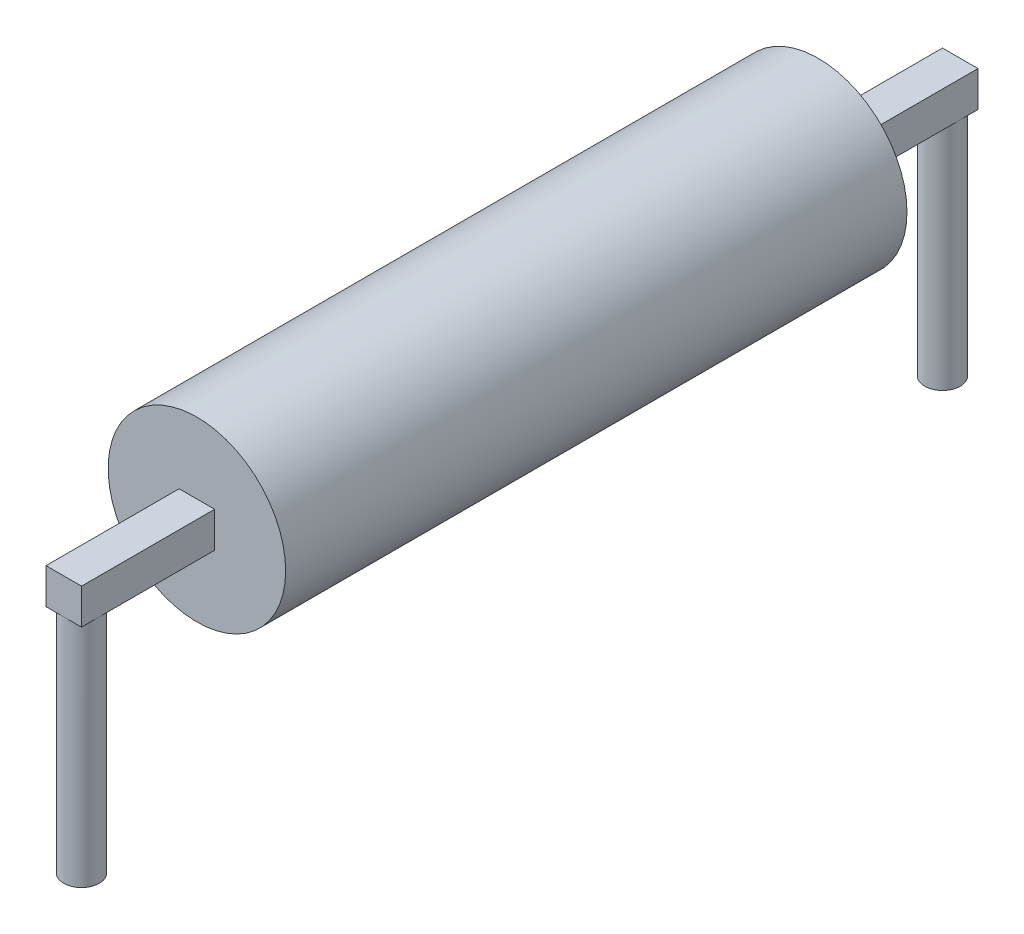
ISO-10303-21;
HEADER;
FILE_DESCRIPTION(('STEP AP214'),'2;1');
FILE_NAME('part.step','',(''),(''),'','','');
FILE_SCHEMA(('AUTOMOTIVE_DESIGN { 1 0 10303 214 1 1 1 1 }'));
ENDSEC;
DATA;
#1=APPLICATION_CONTEXT('core data for automotive mechanical design processes');
#2=APPLICATION_PROTOCOL_DEFINITION('international standard','automotive_design',2000,#1);
#3=PRODUCT_CONTEXT('',#1,'mechanical');
#4=PRODUCT('Part','Part','',(#3));
#5=PRODUCT_RELATED_PRODUCT_CATEGORY('part','',(#4));
#6=PRODUCT_DEFINITION_FORMATION('','',#4);
#7=PRODUCT_DEFINITION_CONTEXT('part definition',#1,'design');
#8=PRODUCT_DEFINITION('design','',#6,#7);
#9=PRODUCT_DEFINITION_SHAPE('','',#8);
#10=(LENGTH_UNIT() NAMED_UNIT(*) SI_UNIT(.MILLI.,.METRE.));
#11=(NAMED_UNIT(*) PLANE_ANGLE_UNIT() SI_UNIT($,.RADIAN.));
#12=(NAMED_UNIT(*) SI_UNIT($,.STERADIAN.) SOLID_ANGLE_UNIT());
#13=UNCERTAINTY_MEASURE_WITH_UNIT(LENGTH_MEASURE(1.E-05),#10,'distance_accuracy_value','');
#14=(GEOMETRIC_REPRESENTATION_CONTEXT(3) GLOBAL_UNCERTAINTY_ASSIGNED_CONTEXT((#13)) GLOBAL_UNIT_ASSIGNED_CONTEXT((#10,
#11,#12)) REPRESENTATION_CONTEXT('',''));
#15=CARTESIAN_POINT('',(0.,0.,0.));
#16=DIRECTION('',(0.,0.,1.));
#17=DIRECTION('',(1.,0.,0.));
#18=AXIS2_PLACEMENT_3D('',#15,#16,#17);
#19=CARTESIAN_POINT('',(-0.5,-0.5,21.25));
#20=DIRECTION('',(0.,1.,0.));
#21=DIRECTION('',(-1.,0.,0.));
#22=AXIS2_PLACEMENT_3D('',#19,#20,#21);
#23=PLANE('',#22);
#24=CARTESIAN_POINT('',(0.,-0.5,-3.5));
#25=DIRECTION('',(0.,-1.,0.));
#26=DIRECTION('',(1.,0.,0.));
#27=AXIS2_PLACEMENT_3D('',#24,#25,#26);
#28=CIRCLE('',#27,0.5);
#29=CARTESIAN_POINT('',(-0.5,-0.5,-3.5));
#30=VERTEX_POINT('',#29);
#31=CARTESIAN_POINT('',(0.,-0.5,-4.));
#32=VERTEX_POINT('',#31);
#33=EDGE_CURVE('E129',#30,#32,#28,.T.);
#34=ORIENTED_EDGE('',*,*,#33,.F.);
#35=DIRECTION('',(0.,0.,-1.));
#36=VECTOR('',#35,1.);
#37=CARTESIAN_POINT('',(-0.5,-0.5,21.25));
#38=LINE('',#37,#36);
#39=CARTESIAN_POINT('',(-0.5,-0.5,-4.));
#40=VERTEX_POINT('',#39);
#41=EDGE_CURVE('E116',#30,#40,#38,.T.);
#42=ORIENTED_EDGE('',*,*,#41,.T.);
#43=DIRECTION('',(1.,0.,0.));
#44=VECTOR('',#43,1.);
#45=CARTESIAN_POINT('',(-0.5,-0.5,-4.));
#46=LINE('',#45,#44);
#47=EDGE_CURVE('E130',#40,#32,#46,.T.);
#48=ORIENTED_EDGE('',*,*,#47,.T.);
#49=EDGE_LOOP('',(#34,#42,#48));
#50=FACE_BOUND('',#49,.T.);
#51=ADVANCED_FACE('F28',(#50),#23,.F.);
#52=CARTESIAN_POINT('',(0.5,-0.5,-3.5));
#53=VERTEX_POINT('',#52);
#54=EDGE_CURVE('E43',#32,#53,#28,.T.);
#55=ORIENTED_EDGE('',*,*,#54,.F.);
#56=CARTESIAN_POINT('',(0.5,-0.5,-4.));
#57=VERTEX_POINT('',#56);
#58=EDGE_CURVE('E147',#32,#57,#46,.T.);
#59=ORIENTED_EDGE('',*,*,#58,.T.);
#60=DIRECTION('',(0.,0.,-1.));
#61=VECTOR('',#60,1.);
#62=CARTESIAN_POINT('',(0.5,-0.5,21.25));
#63=LINE('',#62,#61);
#64=EDGE_CURVE('E173',#53,#57,#63,.T.);
#65=ORIENTED_EDGE('',*,*,#64,.F.);
#66=EDGE_LOOP('',(#55,#59,#65));
#67=FACE_BOUND('',#66,.T.);
#68=ADVANCED_FACE('F229',(#67),#23,.F.);
#69=EDGE_CURVE('E51',#53,#30,#28,.T.);
#70=ORIENTED_EDGE('',*,*,#69,.F.);
#71=CARTESIAN_POINT('',(0.5,-0.5,0.));
#72=VERTEX_POINT('',#71);
#73=EDGE_CURVE('E176',#72,#53,#63,.T.);
#74=ORIENTED_EDGE('',*,*,#73,.F.);
#75=DIRECTION('',(-1.,0.,0.));
#76=VECTOR('',#75,1.);
#77=CARTESIAN_POINT('',(0.,-0.5,0.));
#78=LINE('',#77,#76);
#79=CARTESIAN_POINT('',(-0.5,-0.5,0.));
#80=VERTEX_POINT('',#79);
#81=EDGE_CURVE('E36',#72,#80,#78,.T.);
#82=ORIENTED_EDGE('',*,*,#81,.T.);
#83=EDGE_CURVE('E111',#80,#30,#38,.T.);
#84=ORIENTED_EDGE('',*,*,#83,.T.);
#85=EDGE_LOOP('',(#70,#74,#82,#84));
#86=FACE_BOUND('',#85,.T.);
#87=ADVANCED_FACE('F113',(#86),#23,.F.);
#88=CARTESIAN_POINT('',(0.,-0.5,20.75));
#89=DIRECTION('',(0.,-1.,0.));
#90=DIRECTION('',(1.,0.,0.));
#91=AXIS2_PLACEMENT_3D('',#88,#89,#90);
#92=CIRCLE('',#91,0.500000000000001);
#93=CARTESIAN_POINT('',(-0.5,-0.5,20.75));
#94=VERTEX_POINT('',#93);
#95=CARTESIAN_POINT('',(0.5,-0.5,20.75));
#96=VERTEX_POINT('',#95);
#97=EDGE_CURVE('E136',#94,#96,#92,.T.);
#98=ORIENTED_EDGE('',*,*,#97,.F.);
#99=CARTESIAN_POINT('',(-0.5,-0.5,17.5));
#100=VERTEX_POINT('',#99);
#101=EDGE_CURVE('E115',#94,#100,#38,.T.);
#102=ORIENTED_EDGE('',*,*,#101,.T.);
#103=DIRECTION('',(-1.,0.,0.));
#104=VECTOR('',#103,1.);
#105=CARTESIAN_POINT('',(0.,-0.5,17.5));
#106=LINE('',#105,#104);
#107=CARTESIAN_POINT('',(0.5,-0.5,17.5));
#108=VERTEX_POINT('',#107);
#109=EDGE_CURVE('E184',#108,#100,#106,.T.);
#110=ORIENTED_EDGE('',*,*,#109,.F.);
#111=EDGE_CURVE('E175',#96,#108,#63,.T.);
#112=ORIENTED_EDGE('',*,*,#111,.F.);
#113=EDGE_LOOP('',(#98,#102,#110,#112));
#114=FACE_BOUND('',#113,.T.);
#115=ADVANCED_FACE('F231',(#114),#23,.F.);
#116=CARTESIAN_POINT('',(0.,-0.5,21.25));
#117=VERTEX_POINT('',#116);
#118=EDGE_CURVE('E139',#96,#117,#92,.T.);
#119=ORIENTED_EDGE('',*,*,#118,.F.);
#120=CARTESIAN_POINT('',(0.5,-0.5,21.25));
#121=VERTEX_POINT('',#120);
#122=EDGE_CURVE('E127',#121,#96,#63,.T.);
#123=ORIENTED_EDGE('',*,*,#122,.F.);
#124=DIRECTION('',(1.,0.,0.));
#125=VECTOR('',#124,1.);
#126=CARTESIAN_POINT('',(-0.5,-0.5,21.25));
#127=LINE('',#126,#125);
#128=EDGE_CURVE('E158',#117,#121,#127,.T.);
#129=ORIENTED_EDGE('',*,*,#128,.F.);
#130=EDGE_LOOP('',(#119,#123,#129));
#131=FACE_BOUND('',#130,.T.);
#132=ADVANCED_FACE('F237',(#131),#23,.F.);
#133=EDGE_CURVE('E143',#117,#94,#92,.T.);
#134=ORIENTED_EDGE('',*,*,#133,.F.);
#135=CARTESIAN_POINT('',(-0.5,-0.5,21.25));
#136=VERTEX_POINT('',#135);
#137=EDGE_CURVE('E159',#136,#117,#127,.T.);
#138=ORIENTED_EDGE('',*,*,#137,.F.);
#139=EDGE_CURVE('E118',#136,#94,#38,.T.);
#140=ORIENTED_EDGE('',*,*,#139,.T.);
#141=EDGE_LOOP('',(#134,#138,#140));
#142=FACE_BOUND('',#141,.T.);
#143=ADVANCED_FACE('F224',(#142),#23,.F.);
#144=CARTESIAN_POINT('',(0.,0.,17.5));
#145=DIRECTION('',(0.,0.,1.));
#146=DIRECTION('',(1.,0.,0.));
#147=AXIS2_PLACEMENT_3D('',#144,#145,#146);
#148=PLANE('',#147);
#149=CARTESIAN_POINT('',(0.,0.,17.5));
#150=DIRECTION('',(0.,0.,1.));
#151=DIRECTION('',(1.,0.,0.));
#152=AXIS2_PLACEMENT_3D('',#149,#150,#151);
#153=CIRCLE('',#152,2.5);
#154=CARTESIAN_POINT('',(2.5,0.,17.5));
#155=VERTEX_POINT('',#154);
#156=EDGE_CURVE('E193',#155,#155,#153,.T.);
#157=ORIENTED_EDGE('',*,*,#156,.T.);
#158=EDGE_LOOP('',(#157));
#159=FACE_BOUND('',#158,.T.);
#160=ORIENTED_EDGE('',*,*,#109,.T.);
#161=DIRECTION('',(0.,1.,0.));
#162=VECTOR('',#161,1.);
#163=CARTESIAN_POINT('',(-0.5,0.,17.5));
#164=LINE('',#163,#162);
#165=CARTESIAN_POINT('',(-0.5,0.5,17.5));
#166=VERTEX_POINT('',#165);
#167=EDGE_CURVE('E187',#100,#166,#164,.T.);
#168=ORIENTED_EDGE('',*,*,#167,.T.);
#169=DIRECTION('',(1.,0.,0.));
#170=VECTOR('',#169,1.);
#171=CARTESIAN_POINT('',(0.,0.5,17.5));
#172=LINE('',#171,#170);
#173=CARTESIAN_POINT('',(0.5,0.5,17.5));
#174=VERTEX_POINT('',#173);
#175=EDGE_CURVE('E178',#166,#174,#172,.T.);
#176=ORIENTED_EDGE('',*,*,#175,.T.);
#177=DIRECTION('',(0.,-1.,0.));
#178=VECTOR('',#177,1.);
#179=CARTESIAN_POINT('',(0.5,0.,17.5));
#180=LINE('',#179,#178);
#181=EDGE_CURVE('E181',#174,#108,#180,.T.);
#182=ORIENTED_EDGE('',*,*,#181,.T.);
#183=EDGE_LOOP('',(#160,#168,#176,#182));
#184=FACE_BOUND('',#183,.T.);
#185=ADVANCED_FACE('F216',(#159,#184),#148,.T.);
#186=CARTESIAN_POINT('',(0.,0.,0.));
#187=DIRECTION('',(0.,0.,1.));
#188=DIRECTION('',(1.,0.,0.));
#189=AXIS2_PLACEMENT_3D('',#186,#187,#188);
#190=PLANE('',#189);
#191=CARTESIAN_POINT('',(0.,0.,0.));
#192=DIRECTION('',(0.,0.,1.));
#193=DIRECTION('',(1.,0.,0.));
#194=AXIS2_PLACEMENT_3D('',#191,#192,#193);
#195=CIRCLE('',#194,2.5);
#196=CARTESIAN_POINT('',(2.5,0.,0.));
#197=VERTEX_POINT('',#196);
#198=EDGE_CURVE('E190',#197,#197,#195,.T.);
#199=ORIENTED_EDGE('',*,*,#198,.F.);
#200=EDGE_LOOP('',(#199));
#201=FACE_BOUND('',#200,.T.);
#202=DIRECTION('',(0.,1.,0.));
#203=VECTOR('',#202,1.);
#204=CARTESIAN_POINT('',(-0.5,0.,0.));
#205=LINE('',#204,#203);
#206=CARTESIAN_POINT('',(-0.5,0.5,0.));
#207=VERTEX_POINT('',#206);
#208=EDGE_CURVE('E11',#80,#207,#205,.T.);
#209=ORIENTED_EDGE('',*,*,#208,.F.);
#210=ORIENTED_EDGE('',*,*,#81,.F.);
#211=DIRECTION('',(0.,-1.,0.));
#212=VECTOR('',#211,1.);
#213=CARTESIAN_POINT('',(0.5,0.,0.));
#214=LINE('',#213,#212);
#215=CARTESIAN_POINT('',(0.5,0.5,0.));
#216=VERTEX_POINT('',#215);
#217=EDGE_CURVE('E199',#216,#72,#214,.T.);
#218=ORIENTED_EDGE('',*,*,#217,.F.);
#219=DIRECTION('',(1.,0.,0.));
#220=VECTOR('',#219,1.);
#221=CARTESIAN_POINT('',(0.,0.5,0.));
#222=LINE('',#221,#220);
#223=EDGE_CURVE('E196',#207,#216,#222,.T.);
#224=ORIENTED_EDGE('',*,*,#223,.F.);
#225=EDGE_LOOP('',(#209,#210,#218,#224));
#226=FACE_BOUND('',#225,.T.);
#227=ADVANCED_FACE('F214',(#201,#226),#190,.F.);
#228=CARTESIAN_POINT('',(0.,0.,17.5));
#229=DIRECTION('',(0.,0.,-1.));
#230=DIRECTION('',(-1.,0.,0.));
#231=AXIS2_PLACEMENT_3D('',#228,#229,#230);
#232=CYLINDRICAL_SURFACE('',#231,2.5);
#233=ORIENTED_EDGE('',*,*,#156,.F.);
#234=EDGE_LOOP('',(#233));
#235=FACE_BOUND('',#234,.T.);
#236=ORIENTED_EDGE('',*,*,#198,.T.);
#237=EDGE_LOOP('',(#236));
#238=FACE_BOUND('',#237,.T.);
#239=ADVANCED_FACE('F30',(#235,#238),#232,.T.);
#240=CARTESIAN_POINT('',(-0.5,-0.5,-4.));
#241=DIRECTION('',(0.,0.,-1.));
#242=DIRECTION('',(-1.,0.,0.));
#243=AXIS2_PLACEMENT_3D('',#240,#241,#242);
#244=PLANE('',#243);
#245=DIRECTION('',(0.,-1.,0.));
#246=VECTOR('',#245,1.);
#247=CARTESIAN_POINT('',(-0.5,-0.5,-4.));
#248=LINE('',#247,#246);
#249=CARTESIAN_POINT('',(-0.5,0.5,-4.));
#250=VERTEX_POINT('',#249);
#251=EDGE_CURVE('E123',#250,#40,#248,.T.);
#252=ORIENTED_EDGE('',*,*,#251,.F.);
#253=DIRECTION('',(-1.,0.,0.));
#254=VECTOR('',#253,1.);
#255=CARTESIAN_POINT('',(-0.5,0.5,-4.));
#256=LINE('',#255,#254);
#257=CARTESIAN_POINT('',(0.5,0.5,-4.));
#258=VERTEX_POINT('',#257);
#259=EDGE_CURVE('E152',#258,#250,#256,.T.);
#260=ORIENTED_EDGE('',*,*,#259,.F.);
#261=DIRECTION('',(0.,1.,0.));
#262=VECTOR('',#261,1.);
#263=CARTESIAN_POINT('',(0.5,-0.5,-4.));
#264=LINE('',#263,#262);
#265=EDGE_CURVE('E149',#57,#258,#264,.T.);
#266=ORIENTED_EDGE('',*,*,#265,.F.);
#267=ORIENTED_EDGE('',*,*,#58,.F.);
#268=ORIENTED_EDGE('',*,*,#47,.F.);
#269=EDGE_LOOP('',(#252,#260,#266,#267,#268));
#270=FACE_BOUND('',#269,.T.);
#271=ADVANCED_FACE('F210',(#270),#244,.T.);
#272=CARTESIAN_POINT('',(-0.5,0.5,21.25));
#273=DIRECTION('',(0.,-1.,0.));
#274=DIRECTION('',(0.,0.,-1.));
#275=AXIS2_PLACEMENT_3D('',#272,#273,#274);
#276=PLANE('',#275);
#277=DIRECTION('',(0.,0.,-1.));
#278=VECTOR('',#277,1.);
#279=CARTESIAN_POINT('',(-0.5,0.5,21.25));
#280=LINE('',#279,#278);
#281=EDGE_CURVE('E166',#207,#250,#280,.T.);
#282=ORIENTED_EDGE('',*,*,#281,.F.);
#283=ORIENTED_EDGE('',*,*,#223,.T.);
#284=DIRECTION('',(0.,0.,-1.));
#285=VECTOR('',#284,1.);
#286=CARTESIAN_POINT('',(0.5,0.5,21.25));
#287=LINE('',#286,#285);
#288=EDGE_CURVE('E170',#216,#258,#287,.T.);
#289=ORIENTED_EDGE('',*,*,#288,.T.);
#290=ORIENTED_EDGE('',*,*,#259,.T.);
#291=EDGE_LOOP('',(#282,#283,#289,#290));
#292=FACE_BOUND('',#291,.T.);
#293=ADVANCED_FACE('F213',(#292),#276,.F.);
#294=CARTESIAN_POINT('',(0.5,-0.5,21.25));
#295=DIRECTION('',(-1.,0.,0.));
#296=DIRECTION('',(0.,0.,1.));
#297=AXIS2_PLACEMENT_3D('',#294,#295,#296);
#298=PLANE('',#297);
#299=ORIENTED_EDGE('',*,*,#288,.F.);
#300=ORIENTED_EDGE('',*,*,#217,.T.);
#301=ORIENTED_EDGE('',*,*,#73,.T.);
#302=ORIENTED_EDGE('',*,*,#64,.T.);
#303=ORIENTED_EDGE('',*,*,#265,.T.);
#304=EDGE_LOOP('',(#299,#300,#301,#302,#303));
#305=FACE_BOUND('',#304,.T.);
#306=ADVANCED_FACE('F204',(#305),#298,.F.);
#307=CARTESIAN_POINT('',(-0.5,-0.5,21.25));
#308=DIRECTION('',(1.,0.,0.));
#309=DIRECTION('',(0.,1.,0.));
#310=AXIS2_PLACEMENT_3D('',#307,#308,#309);
#311=PLANE('',#310);
#312=ORIENTED_EDGE('',*,*,#83,.F.);
#313=ORIENTED_EDGE('',*,*,#208,.T.);
#314=ORIENTED_EDGE('',*,*,#281,.T.);
#315=ORIENTED_EDGE('',*,*,#251,.T.);
#316=ORIENTED_EDGE('',*,*,#41,.F.);
#317=EDGE_LOOP('',(#312,#313,#314,#315,#316));
#318=FACE_BOUND('',#317,.T.);
#319=ADVANCED_FACE('F121',(#318),#311,.F.);
#320=ORIENTED_EDGE('',*,*,#167,.F.);
#321=ORIENTED_EDGE('',*,*,#101,.F.);
#322=ORIENTED_EDGE('',*,*,#139,.F.);
#323=DIRECTION('',(0.,-1.,0.));
#324=VECTOR('',#323,1.);
#325=CARTESIAN_POINT('',(-0.5,-0.5,21.25));
#326=LINE('',#325,#324);
#327=CARTESIAN_POINT('',(-0.5,0.5,21.25));
#328=VERTEX_POINT('',#327);
#329=EDGE_CURVE('E155',#328,#136,#326,.T.);
#330=ORIENTED_EDGE('',*,*,#329,.F.);
#331=EDGE_CURVE('E167',#328,#166,#280,.T.);
#332=ORIENTED_EDGE('',*,*,#331,.T.);
#333=EDGE_LOOP('',(#320,#321,#322,#330,#332));
#334=FACE_BOUND('',#333,.T.);
#335=ADVANCED_FACE('F273',(#334),#311,.F.);
#336=ORIENTED_EDGE('',*,*,#181,.F.);
#337=CARTESIAN_POINT('',(0.5,0.5,21.25));
#338=VERTEX_POINT('',#337);
#339=EDGE_CURVE('E171',#338,#174,#287,.T.);
#340=ORIENTED_EDGE('',*,*,#339,.F.);
#341=DIRECTION('',(0.,1.,0.));
#342=VECTOR('',#341,1.);
#343=CARTESIAN_POINT('',(0.5,-0.5,21.25));
#344=LINE('',#343,#342);
#345=EDGE_CURVE('E162',#121,#338,#344,.T.);
#346=ORIENTED_EDGE('',*,*,#345,.F.);
#347=ORIENTED_EDGE('',*,*,#122,.T.);
#348=ORIENTED_EDGE('',*,*,#111,.T.);
#349=EDGE_LOOP('',(#336,#340,#346,#347,#348));
#350=FACE_BOUND('',#349,.T.);
#351=ADVANCED_FACE('F266',(#350),#298,.F.);
#352=ORIENTED_EDGE('',*,*,#175,.F.);
#353=ORIENTED_EDGE('',*,*,#331,.F.);
#354=DIRECTION('',(-1.,0.,0.));
#355=VECTOR('',#354,1.);
#356=CARTESIAN_POINT('',(-0.5,0.5,21.25));
#357=LINE('',#356,#355);
#358=EDGE_CURVE('E164',#338,#328,#357,.T.);
#359=ORIENTED_EDGE('',*,*,#358,.F.);
#360=ORIENTED_EDGE('',*,*,#339,.T.);
#361=EDGE_LOOP('',(#352,#353,#359,#360));
#362=FACE_BOUND('',#361,.T.);
#363=ADVANCED_FACE('F271',(#362),#276,.F.);
#364=CARTESIAN_POINT('',(-0.5,-0.5,21.25));
#365=DIRECTION('',(0.,0.,-1.));
#366=DIRECTION('',(-1.,0.,0.));
#367=AXIS2_PLACEMENT_3D('',#364,#365,#366);
#368=PLANE('',#367);
#369=ORIENTED_EDGE('',*,*,#329,.T.);
#370=ORIENTED_EDGE('',*,*,#137,.T.);
#371=ORIENTED_EDGE('',*,*,#128,.T.);
#372=ORIENTED_EDGE('',*,*,#345,.T.);
#373=ORIENTED_EDGE('',*,*,#358,.T.);
#374=EDGE_LOOP('',(#369,#370,#371,#372,#373));
#375=FACE_BOUND('',#374,.T.);
#376=ADVANCED_FACE('F259',(#375),#368,.F.);
#377=CARTESIAN_POINT('',(0.,-7.,20.75));
#378=DIRECTION('',(0.,1.,0.));
#379=DIRECTION('',(-1.,0.,0.));
#380=AXIS2_PLACEMENT_3D('',#377,#378,#379);
#381=CYLINDRICAL_SURFACE('',#380,0.500000000000001);
#382=CARTESIAN_POINT('',(0.,-7.,20.75));
#383=DIRECTION('',(0.,-1.,0.));
#384=DIRECTION('',(1.,0.,0.));
#385=AXIS2_PLACEMENT_3D('',#382,#383,#384);
#386=CIRCLE('',#385,0.500000000000001);
#387=CARTESIAN_POINT('',(0.500000000000001,-7.,20.75));
#388=VERTEX_POINT('',#387);
#389=EDGE_CURVE('E142',#388,#388,#386,.T.);
#390=ORIENTED_EDGE('',*,*,#389,.F.);
#391=EDGE_LOOP('',(#390));
#392=FACE_BOUND('',#391,.T.);
#393=ORIENTED_EDGE('',*,*,#118,.T.);
#394=ORIENTED_EDGE('',*,*,#133,.T.);
#395=ORIENTED_EDGE('',*,*,#97,.T.);
#396=EDGE_LOOP('',(#393,#394,#395));
#397=FACE_BOUND('',#396,.T.);
#398=ADVANCED_FACE('F261',(#392,#397),#381,.T.);
#399=CARTESIAN_POINT('',(0.,-7.,20.75));
#400=DIRECTION('',(0.,-1.,0.));
#401=DIRECTION('',(1.,0.,0.));
#402=AXIS2_PLACEMENT_3D('',#399,#400,#401);
#403=PLANE('',#402);
#404=ORIENTED_EDGE('',*,*,#389,.T.);
#405=EDGE_LOOP('',(#404));
#406=FACE_BOUND('',#405,.T.);
#407=ADVANCED_FACE('F295',(#406),#403,.T.);
#408=CARTESIAN_POINT('',(0.,-7.,-3.5));
#409=DIRECTION('',(0.,1.,0.));
#410=DIRECTION('',(-1.,0.,0.));
#411=AXIS2_PLACEMENT_3D('',#408,#409,#410);
#412=CYLINDRICAL_SURFACE('',#411,0.5);
#413=CARTESIAN_POINT('',(0.,-7.,-3.5));
#414=DIRECTION('',(0.,-1.,0.));
#415=DIRECTION('',(1.,0.,0.));
#416=AXIS2_PLACEMENT_3D('',#413,#414,#415);
#417=CIRCLE('',#416,0.5);
#418=CARTESIAN_POINT('',(0.5,-7.,-3.5));
#419=VERTEX_POINT('',#418);
#420=EDGE_CURVE('E134',#419,#419,#417,.T.);
#421=ORIENTED_EDGE('',*,*,#420,.F.);
#422=EDGE_LOOP('',(#421));
#423=FACE_BOUND('',#422,.T.);
#424=ORIENTED_EDGE('',*,*,#69,.T.);
#425=ORIENTED_EDGE('',*,*,#33,.T.);
#426=ORIENTED_EDGE('',*,*,#54,.T.);
#427=EDGE_LOOP('',(#424,#425,#426));
#428=FACE_BOUND('',#427,.T.);
#429=ADVANCED_FACE('F133',(#423,#428),#412,.T.);
#430=CARTESIAN_POINT('',(0.,-7.,-3.5));
#431=DIRECTION('',(0.,-1.,0.));
#432=DIRECTION('',(1.,0.,0.));
#433=AXIS2_PLACEMENT_3D('',#430,#431,#432);
#434=PLANE('',#433);
#435=ORIENTED_EDGE('',*,*,#420,.T.);
#436=EDGE_LOOP('',(#435));
#437=FACE_BOUND('',#436,.T.);
#438=ADVANCED_FACE('F302',(#437),#434,.T.);
#439=CLOSED_SHELL('',(#51,#68,#87,#115,#132,#143,#185,#227,#239,#271,#293,#306,#319,#335,#351,
#363,#376,#398,#407,#429,#438));
#440=MANIFOLD_SOLID_BREP('B2',#439);
#441=ADVANCED_BREP_SHAPE_REPRESENTATION('',(#18,#440),#14);
#442=SHAPE_DEFINITION_REPRESENTATION(#9,#441);
ENDSEC;
END-ISO-10303-21;
